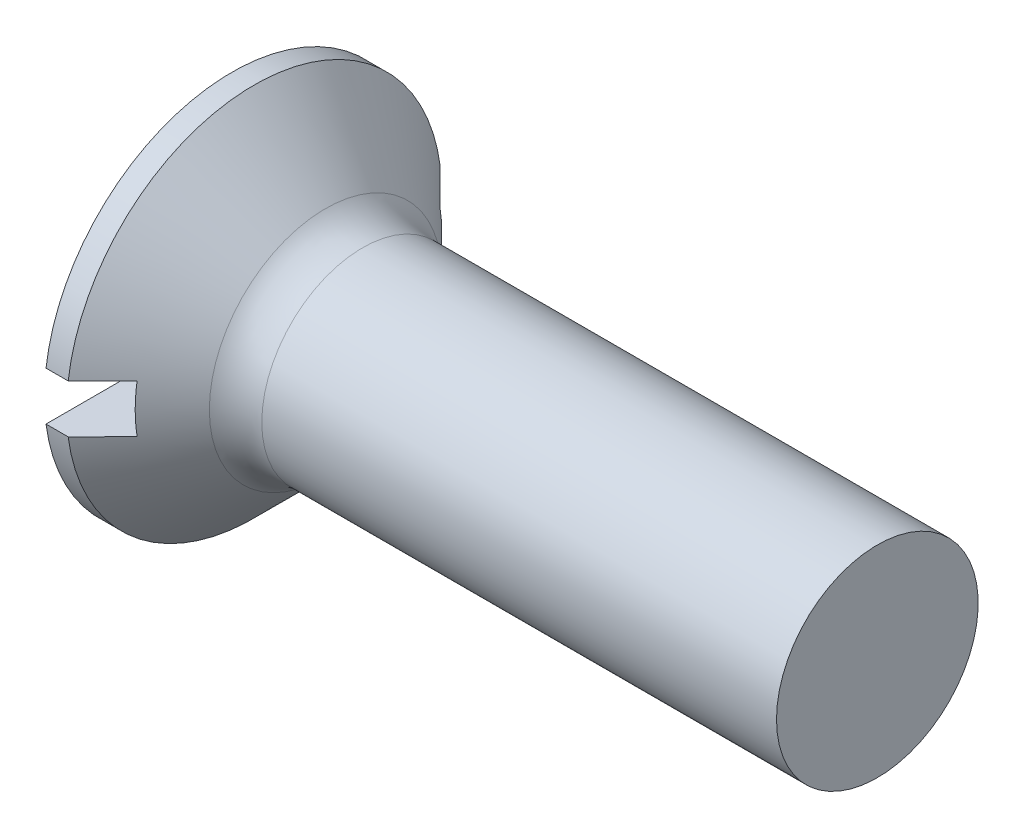
ISO-10303-21;
HEADER;
FILE_DESCRIPTION(('STEP AP214'),'2;1');
FILE_NAME('part.step','',(''),(''),'','','');
FILE_SCHEMA(('AUTOMOTIVE_DESIGN { 1 0 10303 214 1 1 1 1 }'));
ENDSEC;
DATA;
#1=APPLICATION_CONTEXT('core data for automotive mechanical design processes');
#2=APPLICATION_PROTOCOL_DEFINITION('international standard','automotive_design',2000,#1);
#3=PRODUCT_CONTEXT('',#1,'mechanical');
#4=PRODUCT('Part','Part','',(#3));
#5=PRODUCT_RELATED_PRODUCT_CATEGORY('part','',(#4));
#6=PRODUCT_DEFINITION_FORMATION('','',#4);
#7=PRODUCT_DEFINITION_CONTEXT('part definition',#1,'design');
#8=PRODUCT_DEFINITION('design','',#6,#7);
#9=PRODUCT_DEFINITION_SHAPE('','',#8);
#10=(LENGTH_UNIT() NAMED_UNIT(*) SI_UNIT(.MILLI.,.METRE.));
#11=(NAMED_UNIT(*) PLANE_ANGLE_UNIT() SI_UNIT($,.RADIAN.));
#12=(NAMED_UNIT(*) SI_UNIT($,.STERADIAN.) SOLID_ANGLE_UNIT());
#13=UNCERTAINTY_MEASURE_WITH_UNIT(LENGTH_MEASURE(1.E-05),#10,'distance_accuracy_value','');
#14=(GEOMETRIC_REPRESENTATION_CONTEXT(3) GLOBAL_UNCERTAINTY_ASSIGNED_CONTEXT((#13)) GLOBAL_UNIT_ASSIGNED_CONTEXT((#10,
#11,#12)) REPRESENTATION_CONTEXT('',''));
#15=CARTESIAN_POINT('',(0.,0.,0.));
#16=DIRECTION('',(0.,0.,1.));
#17=DIRECTION('',(1.,0.,0.));
#18=AXIS2_PLACEMENT_3D('',#15,#16,#17);
#19=CARTESIAN_POINT('',(-6.34999999999999,0.,0.));
#20=DIRECTION('',(-1.,0.,0.));
#21=DIRECTION('',(0.,0.,1.));
#22=AXIS2_PLACEMENT_3D('',#19,#20,#21);
#23=CYLINDRICAL_SURFACE('',#22,4.65);
#24=DIRECTION('',(-1.,0.,0.));
#25=VECTOR('',#24,1.);
#26=CARTESIAN_POINT('',(-6.34999999999999,0.599999999999999,-4.61112784468182));
#27=LINE('',#26,#25);
#28=CARTESIAN_POINT('',(0.,0.599999999999999,-4.61112784468182));
#29=VERTEX_POINT('',#28);
#30=CARTESIAN_POINT('',(0.550000000000008,0.599999999999999,-4.61112784468182));
#31=VERTEX_POINT('',#30);
#32=EDGE_CURVE('E59',#29,#31,#27,.F.);
#33=ORIENTED_EDGE('',*,*,#32,.F.);
#34=CARTESIAN_POINT('',(0.,0.,0.));
#35=DIRECTION('',(-1.,0.,0.));
#36=DIRECTION('',(0.,0.,1.));
#37=AXIS2_PLACEMENT_3D('',#34,#35,#36);
#38=CIRCLE('',#37,4.65);
#39=CARTESIAN_POINT('',(0.,0.600000000000001,4.61112784468182));
#40=VERTEX_POINT('',#39);
#41=EDGE_CURVE('E106',#40,#29,#38,.T.);
#42=ORIENTED_EDGE('',*,*,#41,.F.);
#43=DIRECTION('',(-1.,0.,0.));
#44=VECTOR('',#43,1.);
#45=CARTESIAN_POINT('',(-6.34999999999999,0.6,4.61112784468182));
#46=LINE('',#45,#44);
#47=CARTESIAN_POINT('',(0.550000000000008,0.6,4.61112784468182));
#48=VERTEX_POINT('',#47);
#49=EDGE_CURVE('E148',#48,#40,#46,.T.);
#50=ORIENTED_EDGE('',*,*,#49,.F.);
#51=CARTESIAN_POINT('',(0.550000000000008,0.,0.));
#52=DIRECTION('',(-1.,0.,0.));
#53=DIRECTION('',(0.,0.,1.));
#54=AXIS2_PLACEMENT_3D('',#51,#52,#53);
#55=CIRCLE('',#54,4.65);
#56=EDGE_CURVE('E115',#48,#31,#55,.T.);
#57=ORIENTED_EDGE('',*,*,#56,.T.);
#58=EDGE_LOOP('',(#33,#42,#50,#57));
#59=FACE_BOUND('',#58,.T.);
#60=ADVANCED_FACE('F36',(#59),#23,.T.);
#61=CARTESIAN_POINT('',(0.,0.,0.));
#62=DIRECTION('',(-1.,0.,0.));
#63=DIRECTION('',(0.,0.,1.));
#64=AXIS2_PLACEMENT_3D('',#61,#62,#63);
#65=PLANE('',#64);
#66=DIRECTION('',(0.,0.,-1.));
#67=VECTOR('',#66,1.);
#68=CARTESIAN_POINT('',(0.,0.6,0.));
#69=LINE('',#68,#67);
#70=EDGE_CURVE('E93',#40,#29,#69,.T.);
#71=ORIENTED_EDGE('',*,*,#70,.F.);
#72=ORIENTED_EDGE('',*,*,#41,.T.);
#73=EDGE_LOOP('',(#71,#72));
#74=FACE_BOUND('',#73,.T.);
#75=ADVANCED_FACE('F166',(#74),#65,.T.);
#76=CARTESIAN_POINT('',(16.,2.5,0.));
#77=DIRECTION('',(1.,0.,0.));
#78=DIRECTION('',(0.,0.,-1.));
#79=AXIS2_PLACEMENT_3D('',#76,#77,#78);
#80=PLANE('',#79);
#81=CARTESIAN_POINT('',(16.,0.,0.));
#82=DIRECTION('',(-1.,0.,0.));
#83=DIRECTION('',(0.,0.,1.));
#84=AXIS2_PLACEMENT_3D('',#81,#82,#83);
#85=CIRCLE('',#84,2.5);
#86=CARTESIAN_POINT('',(16.,0.,2.5));
#87=VERTEX_POINT('',#86);
#88=EDGE_CURVE('E116',#87,#87,#85,.T.);
#89=ORIENTED_EDGE('',*,*,#88,.F.);
#90=EDGE_LOOP('',(#89));
#91=FACE_BOUND('',#90,.T.);
#92=ADVANCED_FACE('F177',(#91),#80,.T.);
#93=CARTESIAN_POINT('',(-6.34999999999999,0.,0.));
#94=DIRECTION('',(-1.,0.,0.));
#95=DIRECTION('',(0.,0.,1.));
#96=AXIS2_PLACEMENT_3D('',#93,#94,#95);
#97=CYLINDRICAL_SURFACE('',#96,2.5);
#98=CARTESIAN_POINT('',(3.23847763108502,0.,0.));
#99=DIRECTION('',(-1.,0.,0.));
#100=DIRECTION('',(0.,0.,1.));
#101=AXIS2_PLACEMENT_3D('',#98,#99,#100);
#102=CIRCLE('',#101,2.5);
#103=CARTESIAN_POINT('',(3.23847763108502,0.,2.5));
#104=VERTEX_POINT('',#103);
#105=EDGE_CURVE('E94',#104,#104,#102,.F.);
#106=ORIENTED_EDGE('',*,*,#105,.T.);
#107=EDGE_LOOP('',(#106));
#108=FACE_BOUND('',#107,.T.);
#109=ORIENTED_EDGE('',*,*,#88,.T.);
#110=EDGE_LOOP('',(#109));
#111=FACE_BOUND('',#110,.T.);
#112=ADVANCED_FACE('F171',(#108,#111),#97,.T.);
#113=CARTESIAN_POINT('',(0.550000000000008,0.,0.));
#114=DIRECTION('',(-1.,0.,0.));
#115=DIRECTION('',(0.,0.,1.));
#116=AXIS2_PLACEMENT_3D('',#113,#114,#115);
#117=CONICAL_SURFACE('',#116,4.65,0.78539816339745);
#118=CARTESIAN_POINT('',(-5.05345798085363,0.599999999999999,-10.2358878738061));
#119=CARTESIAN_POINT('',(-4.7063338820772,0.599999999999999,-9.88816346765386));
#120=CARTESIAN_POINT('',(-4.35923588911081,0.599999999999999,-9.54041298783456));
#121=CARTESIAN_POINT('',(-3.66512028999245,0.599999999999999,-8.84482295341688));
#122=CARTESIAN_POINT('',(-3.31810268492326,0.599999999999999,-8.49698339773806));
#123=CARTESIAN_POINT('',(-2.6240861085145,0.599999999999999,-7.80108810044584));
#124=CARTESIAN_POINT('',(-2.27708717061556,0.599999999999999,-7.45303232547743));
#125=CARTESIAN_POINT('',(-1.58327190960451,0.599999999999999,-6.75674744401149));
#126=CARTESIAN_POINT('',(-1.23645558427177,0.599999999999999,-6.40851833972679));
#127=CARTESIAN_POINT('',(-0.530234288880178,0.599999999999999,-5.69884909860565));
#128=CARTESIAN_POINT('',(-0.170839920396749,0.599999999999999,-5.3373984063476));
#129=CARTESIAN_POINT('',(0.367846499606963,0.599999999999999,-4.79480605507249));
#130=CARTESIAN_POINT('',(0.547344617567886,0.599999999999999,-4.61386901631147));
#131=CARTESIAN_POINT('',(0.906142780462511,0.599999999999999,-4.251800035553));
#132=CARTESIAN_POINT('',(1.08544282617177,0.599999999999999,-4.07066809432422));
#133=CARTESIAN_POINT('',(1.44372217573977,0.599999999999999,-3.70815209675442));
#134=CARTESIAN_POINT('',(1.62270153193744,0.6,-3.52676809217752));
#135=CARTESIAN_POINT('',(1.98021132361776,0.6,-3.16355280067778));
#136=CARTESIAN_POINT('',(2.1587417523097,0.6,-2.98172150707034));
#137=CARTESIAN_POINT('',(2.51504600954838,0.6,-2.61734150295503));
#138=CARTESIAN_POINT('',(2.69281988935326,0.6,-2.43479284271594));
#139=CARTESIAN_POINT('',(2.95840184240507,0.6,-2.15993102072038));
#140=CARTESIAN_POINT('',(3.0467482793297,0.6,-2.06813839931134));
#141=CARTESIAN_POINT('',(3.22290791170148,0.6,-1.8840432741785));
#142=CARTESIAN_POINT('',(3.31072111192471,0.6,-1.79174077503573));
#143=CARTESIAN_POINT('',(3.44507973379147,0.6,-1.64924720242533));
#144=CARTESIAN_POINT('',(3.49191887004633,0.6,-1.59933324859849));
#145=CARTESIAN_POINT('',(3.58528403723339,0.6,-1.49921165532858));
#146=CARTESIAN_POINT('',(3.63181006313953,0.6,-1.44900401119525));
#147=CARTESIAN_POINT('',(3.72427703260543,0.6,-1.348388660684));
#148=CARTESIAN_POINT('',(3.77021949037902,0.6,-1.29798234998228));
#149=CARTESIAN_POINT('',(3.86152904277955,0.6,-1.19665513561933));
#150=CARTESIAN_POINT('',(3.90689615796224,0.6,-1.1457342504602));
#151=CARTESIAN_POINT('',(4.01209252723327,0.6,-1.02578570206612));
#152=CARTESIAN_POINT('',(4.07160553566885,0.6,-0.956477036268247));
#153=CARTESIAN_POINT('',(4.15917887607318,0.6,-0.850702358470613));
#154=CARTESIAN_POINT('',(4.18818199499264,0.6,-0.815019024045418));
#155=CARTESIAN_POINT('',(4.24528795110788,0.6,-0.742941326145325));
#156=CARTESIAN_POINT('',(4.27339088381092,0.6,-0.706547038764567));
#157=CARTESIAN_POINT('',(4.32869682497791,0.6,-0.632291545018036));
#158=CARTESIAN_POINT('',(4.35588213575686,0.6,-0.594417046382877));
#159=CARTESIAN_POINT('',(4.40832254729278,0.6,-0.517260214202537));
#160=CARTESIAN_POINT('',(4.43357498481566,0.6,-0.477976043956169));
#161=CARTESIAN_POINT('',(4.48075024121381,0.6,-0.397940392744045));
#162=CARTESIAN_POINT('',(4.50270366327433,0.6,-0.357207379701578));
#163=CARTESIAN_POINT('',(4.54164745720656,0.6,-0.273493725174854));
#164=CARTESIAN_POINT('',(4.55865364653391,0.6,-0.230520776744234));
#165=CARTESIAN_POINT('',(4.58372379462179,0.6,-0.145820085871144));
#166=CARTESIAN_POINT('',(4.59242377597666,0.6,-0.104295783748555));
#167=CARTESIAN_POINT('',(4.59893532241227,0.6,-0.0414391937715868));
#168=CARTESIAN_POINT('',(4.60002000613735,0.6,-0.0204304556953823));
#169=CARTESIAN_POINT('',(4.59997943950967,0.6,0.0215839024601802));
#170=CARTESIAN_POINT('',(4.59885411345371,0.6,0.0425895224080781));
#171=CARTESIAN_POINT('',(4.59227145283522,0.6,0.105015205121541));
#172=CARTESIAN_POINT('',(4.58363501258282,0.6,0.1461245792122));
#173=CARTESIAN_POINT('',(4.565808560724,0.6,0.206345557501642));
#174=CARTESIAN_POINT('',(4.55901965609655,0.6,0.226250715937574));
#175=CARTESIAN_POINT('',(4.54410905338993,0.6,0.265557322006365));
#176=CARTESIAN_POINT('',(4.53598757591988,0.6,0.284958852400758));
#177=CARTESIAN_POINT('',(4.51162458134292,0.6,0.33886087793319));
#178=CARTESIAN_POINT('',(4.49415337187064,0.6,0.372800556957469));
#179=CARTESIAN_POINT('',(4.45684225886175,0.6,0.439365473741558));
#180=CARTESIAN_POINT('',(4.436999696206,0.6,0.471989179975826));
#181=CARTESIAN_POINT('',(4.39563171221961,0.6,0.536298629600311));
#182=CARTESIAN_POINT('',(4.37410080185607,0.6,0.567980809264082));
#183=CARTESIAN_POINT('',(4.32989042558404,0.6,0.630537340732859));
#184=CARTESIAN_POINT('',(4.30721068113902,0.6,0.661411493852085));
#185=CARTESIAN_POINT('',(4.23751211011742,0.6,0.753681353138899));
#186=CARTESIAN_POINT('',(4.18923822306601,0.6,0.814124888465016));
#187=CARTESIAN_POINT('',(4.0909576629573,0.6,0.933321700638785));
#188=CARTESIAN_POINT('',(4.04095530157681,0.6,0.992078596429102));
#189=CARTESIAN_POINT('',(3.94086297328448,0.6,1.10735067105448));
#190=CARTESIAN_POINT('',(3.89079728066038,0.6,1.16388697288741));
#191=CARTESIAN_POINT('',(3.78992367247538,0.6,1.27629304811311));
#192=CARTESIAN_POINT('',(3.73911573838906,0.6,1.33216280480632));
#193=CARTESIAN_POINT('',(3.58591315191241,0.6,1.49908452635045));
#194=CARTESIAN_POINT('',(3.4827535526898,0.6,1.609433299801));
#195=CARTESIAN_POINT('',(3.27521830235561,0.6,1.82922471356774));
#196=CARTESIAN_POINT('',(3.17084134295835,0.6,1.93866611055463));
#197=CARTESIAN_POINT('',(2.96141984922221,0.6,2.15689179192462));
#198=CARTESIAN_POINT('',(2.85637536705428,0.6,2.26567612639587));
#199=CARTESIAN_POINT('',(2.64692360208388,0.6,2.481710644307));
#200=CARTESIAN_POINT('',(2.54252076901649,0.6,2.58896514889977));
#201=CARTESIAN_POINT('',(2.33341496587688,0.6,2.80318525747578));
#202=CARTESIAN_POINT('',(2.22871198983414,0.6,2.91015085562865));
#203=CARTESIAN_POINT('',(1.91438863951787,0.6,3.23063427951566));
#204=CARTESIAN_POINT('',(1.70445280610492,0.6,3.44384256715819));
#205=CARTESIAN_POINT('',(1.22510768237794,0.600000000000001,3.9295930523411));
#206=CARTESIAN_POINT('',(0.9555489283914,0.600000000000001,4.20198758385551));
#207=CARTESIAN_POINT('',(0.416004890581449,0.600000000000001,4.74635530428132));
#208=CARTESIAN_POINT('',(0.146019605475203,0.600000000000001,5.01832849192059));
#209=CARTESIAN_POINT('',(-0.664426807694018,0.600000000000001,5.83398149060915));
#210=CARTESIAN_POINT('',(-1.2052682118604,0.600000000000001,6.37728333249965));
#211=CARTESIAN_POINT('',(-2.297244515822,0.600000000000001,7.47334328359636));
#212=CARTESIAN_POINT('',(-2.84838746103815,0.600000000000001,8.02609337109332));
#213=CARTESIAN_POINT('',(-3.95082527410524,0.600000000000001,9.1312059158983));
#214=CARTESIAN_POINT('',(-4.5021200841492,0.600000000000001,9.683568430867));
#215=CARTESIAN_POINT('',(-5.05345798085363,0.600000000000001,10.2358878738061));
#216=B_SPLINE_CURVE_WITH_KNOTS('',3,(#118,#119,#120,#121,#122,#123,#124,#125,#126,#127,#128,
#129,#130,#131,#132,#133,#134,#135,#136,#137,#138,#139,#140,#141,#142,#143,#144,#145,#146,#147,
#148,#149,#150,#151,#152,#153,#154,#155,#156,#157,#158,#159,#160,#161,#162,#163,#164,#165,#166,
#167,#168,#169,#170,#171,#172,#173,#174,#175,#176,#177,#178,#179,#180,#181,#182,#183,#184,#185,
#186,#187,#188,#189,#190,#191,#192,#193,#194,#195,#196,#197,#198,#199,#200,#201,#202,#203,#204,
#205,#206,#207,#208,#209,#210,#211,#212,#213,#214,#215),.UNSPECIFIED.,.F.,.F.,(4,2,2,2,2,2,2,2,
2,2,2,2,2,2,2,2,2,2,2,2,2,2,2,2,2,2,2,2,2,2,2,2,2,2,2,2,2,2,2,2,2,2,2,2,2,2,2,2,4),(0.,
1.47399683090689,2.94801247877137,4.42244783615749,5.89686482953468,7.42601395143836,
8.19061836510007,8.95521977425754,9.71968231604465,10.4841563527515,11.2485777423704,
11.630779125471,12.0129770802189,12.2183239645211,12.4236741372326,12.6282760301194,
12.8328705923058,13.1068888942381,13.2448295456087,13.3827555130536,13.522578829549,
13.6625914591711,13.8012122737476,13.9393848876123,14.0658401529418,14.1288404679688,
14.1918429410897,14.3170190368162,14.3800826362346,14.4431358059084,14.557498941854,
14.6719915440135,14.7868731764568,14.9017827966977,15.1337679990585,15.365211229124,
15.5917537379438,15.8183019106741,16.2714608987008,16.7251625423049,17.1788291521206,
17.6278622396792,18.076904322379,18.9745538574966,20.1242253982685,21.2739004034116,
23.5737206872119,25.9154338775763,28.2566456069255),.UNSPECIFIED.);
#217=CARTESIAN_POINT('',(1.4,0.6,3.75233260785875));
#218=VERTEX_POINT('',#217);
#219=EDGE_CURVE('E111',#218,#48,#216,.T.);
#220=ORIENTED_EDGE('',*,*,#219,.F.);
#221=CARTESIAN_POINT('',(1.4,0.,0.));
#222=DIRECTION('',(1.,0.,0.));
#223=DIRECTION('',(0.,0.,-1.));
#224=AXIS2_PLACEMENT_3D('',#221,#222,#223);
#225=CIRCLE('',#224,3.80000000000001);
#226=CARTESIAN_POINT('',(1.4,-0.600000000000001,3.75233260785875));
#227=VERTEX_POINT('',#226);
#228=EDGE_CURVE('E11',#227,#218,#225,.F.);
#229=ORIENTED_EDGE('',*,*,#228,.F.);
#230=CARTESIAN_POINT('',(-5.05345798085363,-0.600000000000001,10.2358878738061));
#231=CARTESIAN_POINT('',(-4.7063338820772,-0.600000000000001,9.88816346765386));
#232=CARTESIAN_POINT('',(-4.35923588911081,-0.600000000000001,9.54041298783456));
#233=CARTESIAN_POINT('',(-3.66512028999245,-0.600000000000001,8.84482295341688));
#234=CARTESIAN_POINT('',(-3.31810268492326,-0.600000000000001,8.49698339773806));
#235=CARTESIAN_POINT('',(-2.6240861085145,-0.600000000000001,7.80108810044584));
#236=CARTESIAN_POINT('',(-2.27708717061556,-0.600000000000001,7.45303232547743));
#237=CARTESIAN_POINT('',(-1.58327190960451,-0.600000000000001,6.75674744401148));
#238=CARTESIAN_POINT('',(-1.23645558427177,-0.600000000000001,6.40851833972678));
#239=CARTESIAN_POINT('',(-0.530234288880175,-0.600000000000001,5.69884909860565));
#240=CARTESIAN_POINT('',(-0.170839920396746,-0.600000000000001,5.3373984063476));
#241=CARTESIAN_POINT('',(0.367846499606966,-0.600000000000001,4.79480605507249));
#242=CARTESIAN_POINT('',(0.547344617567889,-0.600000000000001,4.61386901631146));
#243=CARTESIAN_POINT('',(0.906142780462514,-0.600000000000001,4.251800035553));
#244=CARTESIAN_POINT('',(1.08544282617177,-0.600000000000001,4.07066809432422));
#245=CARTESIAN_POINT('',(1.44372217573977,-0.600000000000001,3.70815209675441));
#246=CARTESIAN_POINT('',(1.62270153193744,-0.600000000000001,3.52676809217752));
#247=CARTESIAN_POINT('',(1.98021132361776,-0.600000000000001,3.16355280067778));
#248=CARTESIAN_POINT('',(2.1587417523097,-0.600000000000001,2.98172150707033));
#249=CARTESIAN_POINT('',(2.51504600954839,-0.600000000000001,2.61734150295503));
#250=CARTESIAN_POINT('',(2.69281988935326,-0.600000000000001,2.43479284271593));
#251=CARTESIAN_POINT('',(2.95840184240507,-0.600000000000001,2.15993102072037));
#252=CARTESIAN_POINT('',(3.0467482793297,-0.600000000000001,2.06813839931134));
#253=CARTESIAN_POINT('',(3.22290791170148,-0.600000000000001,1.88404327417849));
#254=CARTESIAN_POINT('',(3.31072111192471,-0.600000000000001,1.79174077503573));
#255=CARTESIAN_POINT('',(3.44507973379147,-0.600000000000001,1.64924720242533));
#256=CARTESIAN_POINT('',(3.49191887004633,-0.600000000000001,1.59933324859849));
#257=CARTESIAN_POINT('',(3.58528403723339,-0.600000000000001,1.49921165532858));
#258=CARTESIAN_POINT('',(3.63181006313953,-0.600000000000001,1.44900401119525));
#259=CARTESIAN_POINT('',(3.72427703260543,-0.600000000000001,1.348388660684));
#260=CARTESIAN_POINT('',(3.77021949037902,-0.600000000000001,1.29798234998228));
#261=CARTESIAN_POINT('',(3.86152904277955,-0.600000000000001,1.19665513561933));
#262=CARTESIAN_POINT('',(3.90689615796224,-0.600000000000001,1.1457342504602));
#263=CARTESIAN_POINT('',(4.01209252723327,-0.600000000000001,1.02578570206612));
#264=CARTESIAN_POINT('',(4.07160553566885,-0.600000000000001,0.956477036268246));
#265=CARTESIAN_POINT('',(4.15917887607317,-0.600000000000001,0.850702358470612));
#266=CARTESIAN_POINT('',(4.18818199499264,-0.600000000000001,0.815019024045418));
#267=CARTESIAN_POINT('',(4.24528795110788,-0.600000000000001,0.742941326145326));
#268=CARTESIAN_POINT('',(4.27339088381092,-0.600000000000001,0.706547038764567));
#269=CARTESIAN_POINT('',(4.32869682497791,-0.600000000000001,0.632291545018035));
#270=CARTESIAN_POINT('',(4.35588213575686,-0.600000000000001,0.594417046382876));
#271=CARTESIAN_POINT('',(4.40832254729278,-0.600000000000001,0.517260214202537));
#272=CARTESIAN_POINT('',(4.43357498481566,-0.600000000000001,0.477976043956169));
#273=CARTESIAN_POINT('',(4.48075024121381,-0.600000000000001,0.397940392744045));
#274=CARTESIAN_POINT('',(4.50270366327432,-0.600000000000001,0.357207379701577));
#275=CARTESIAN_POINT('',(4.54164745720656,-0.600000000000001,0.273493725174853));
#276=CARTESIAN_POINT('',(4.55865364653391,-0.600000000000001,0.230520776744233));
#277=CARTESIAN_POINT('',(4.58372379462179,-0.600000000000001,0.145820085871143));
#278=CARTESIAN_POINT('',(4.59242377597666,-0.600000000000001,0.104295783748554));
#279=CARTESIAN_POINT('',(4.59893532241227,-0.600000000000001,0.0414391937715858));
#280=CARTESIAN_POINT('',(4.60002000613735,-0.600000000000001,0.0204304556953813));
#281=CARTESIAN_POINT('',(4.59997943950967,-0.600000000000001,-0.0215839024601812));
#282=CARTESIAN_POINT('',(4.59885411345371,-0.600000000000001,-0.0425895224080791));
#283=CARTESIAN_POINT('',(4.59227145283522,-0.600000000000001,-0.105015205121542));
#284=CARTESIAN_POINT('',(4.58363501258282,-0.600000000000001,-0.146124579212201));
#285=CARTESIAN_POINT('',(4.565808560724,-0.600000000000001,-0.206345557501643));
#286=CARTESIAN_POINT('',(4.55901965609655,-0.600000000000001,-0.226250715937575));
#287=CARTESIAN_POINT('',(4.54410905338993,-0.600000000000001,-0.265557322006366));
#288=CARTESIAN_POINT('',(4.53598757591988,-0.600000000000001,-0.284958852400759));
#289=CARTESIAN_POINT('',(4.51162458134292,-0.600000000000001,-0.338860877933191));
#290=CARTESIAN_POINT('',(4.49415337187064,-0.600000000000001,-0.37280055695747));
#291=CARTESIAN_POINT('',(4.45684225886175,-0.600000000000001,-0.439365473741559));
#292=CARTESIAN_POINT('',(4.43699969620599,-0.600000000000001,-0.471989179975827));
#293=CARTESIAN_POINT('',(4.3956317122196,-0.600000000000001,-0.536298629600312));
#294=CARTESIAN_POINT('',(4.37410080185606,-0.600000000000001,-0.567980809264083));
#295=CARTESIAN_POINT('',(4.32989042558404,-0.600000000000001,-0.630537340732861));
#296=CARTESIAN_POINT('',(4.30721068113901,-0.600000000000001,-0.661411493852087));
#297=CARTESIAN_POINT('',(4.23751211011741,-0.600000000000001,-0.753681353138901));
#298=CARTESIAN_POINT('',(4.18923822306601,-0.600000000000001,-0.814124888465018));
#299=CARTESIAN_POINT('',(4.09095766295729,-0.600000000000001,-0.933321700638788));
#300=CARTESIAN_POINT('',(4.04095530157681,-0.600000000000001,-0.992078596429105));
#301=CARTESIAN_POINT('',(3.94086297328448,-0.600000000000001,-1.10735067105448));
#302=CARTESIAN_POINT('',(3.89079728066038,-0.600000000000001,-1.16388697288741));
#303=CARTESIAN_POINT('',(3.78992367247537,-0.600000000000001,-1.27629304811312));
#304=CARTESIAN_POINT('',(3.73911573838905,-0.600000000000001,-1.33216280480632));
#305=CARTESIAN_POINT('',(3.58591315191241,-0.600000000000001,-1.49908452635045));
#306=CARTESIAN_POINT('',(3.48275355268979,-0.600000000000001,-1.609433299801));
#307=CARTESIAN_POINT('',(3.2752183023556,-0.600000000000001,-1.82922471356774));
#308=CARTESIAN_POINT('',(3.17084134295834,-0.600000000000001,-1.93866611055464));
#309=CARTESIAN_POINT('',(2.96141984922221,-0.600000000000001,-2.15689179192463));
#310=CARTESIAN_POINT('',(2.85637536705427,-0.600000000000001,-2.26567612639588));
#311=CARTESIAN_POINT('',(2.64692360208388,-0.600000000000001,-2.48171064430701));
#312=CARTESIAN_POINT('',(2.54252076901649,-0.600000000000001,-2.58896514889978));
#313=CARTESIAN_POINT('',(2.33341496587688,-0.600000000000001,-2.80318525747578));
#314=CARTESIAN_POINT('',(2.22871198983413,-0.600000000000001,-2.91015085562865));
#315=CARTESIAN_POINT('',(1.91438863951786,-0.600000000000001,-3.23063427951567));
#316=CARTESIAN_POINT('',(1.70445280610491,-0.600000000000001,-3.4438425671582));
#317=CARTESIAN_POINT('',(1.22510768237793,-0.600000000000001,-3.92959305234111));
#318=CARTESIAN_POINT('',(0.955548928391392,-0.600000000000001,-4.20198758385552));
#319=CARTESIAN_POINT('',(0.416004890581442,-0.600000000000001,-4.74635530428133));
#320=CARTESIAN_POINT('',(0.146019605475196,-0.600000000000001,-5.0183284919206));
#321=CARTESIAN_POINT('',(-0.664426807694024,-0.600000000000001,-5.83398149060915));
#322=CARTESIAN_POINT('',(-1.2052682118604,-0.600000000000001,-6.37728333249966));
#323=CARTESIAN_POINT('',(-2.29724451582201,-0.600000000000001,-7.47334328359636));
#324=CARTESIAN_POINT('',(-2.84838746103816,-0.600000000000001,-8.02609337109332));
#325=CARTESIAN_POINT('',(-3.95082527410525,-0.600000000000001,-9.1312059158983));
#326=CARTESIAN_POINT('',(-4.5021200841492,-0.600000000000001,-9.68356843086701));
#327=CARTESIAN_POINT('',(-5.05345798085363,-0.600000000000001,-10.2358878738061));
#328=B_SPLINE_CURVE_WITH_KNOTS('',3,(#230,#231,#232,#233,#234,#235,#236,#237,#238,#239,#240,
#241,#242,#243,#244,#245,#246,#247,#248,#249,#250,#251,#252,#253,#254,#255,#256,#257,#258,#259,
#260,#261,#262,#263,#264,#265,#266,#267,#268,#269,#270,#271,#272,#273,#274,#275,#276,#277,#278,
#279,#280,#281,#282,#283,#284,#285,#286,#287,#288,#289,#290,#291,#292,#293,#294,#295,#296,#297,
#298,#299,#300,#301,#302,#303,#304,#305,#306,#307,#308,#309,#310,#311,#312,#313,#314,#315,#316,
#317,#318,#319,#320,#321,#322,#323,#324,#325,#326,#327),.UNSPECIFIED.,.F.,.F.,(4,2,2,2,2,2,2,2,
2,2,2,2,2,2,2,2,2,2,2,2,2,2,2,2,2,2,2,2,2,2,2,2,2,2,2,2,2,2,2,2,2,2,2,2,2,2,2,2,4),(0.,
1.47399683090689,2.94801247877137,4.4224478361575,5.89686482953469,7.42601395143836,
8.19061836510007,8.95521977425755,9.71968231604465,10.4841563527515,11.2485777423704,
11.630779125471,12.0129770802189,12.2183239645211,12.4236741372326,12.6282760301194,
12.8328705923058,13.1068888942381,13.2448295456087,13.3827555130536,13.522578829549,
13.6625914591711,13.8012122737476,13.9393848876123,14.0658401529418,14.1288404679688,
14.1918429410897,14.3170190368162,14.3800826362346,14.4431358059084,14.557498941854,
14.6719915440135,14.7868731764568,14.9017827966977,15.1337679990585,15.365211229124,
15.5917537379438,15.8183019106741,16.2714608987008,16.7251625423049,17.1788291521206,
17.6278622396792,18.076904322379,18.9745538574966,20.1242253982686,21.2739004034116,
23.5737206872119,25.9154338775763,28.2566456069255),.UNSPECIFIED.);
#329=CARTESIAN_POINT('',(0.550000000000008,-0.600000000000001,4.61112784468182));
#330=VERTEX_POINT('',#329);
#331=EDGE_CURVE('E102',#330,#227,#328,.T.);
#332=ORIENTED_EDGE('',*,*,#331,.F.);
#333=CARTESIAN_POINT('',(0.550000000000008,-0.600000000000001,-4.61112784468182));
#334=VERTEX_POINT('',#333);
#335=EDGE_CURVE('E101',#334,#330,#55,.T.);
#336=ORIENTED_EDGE('',*,*,#335,.F.);
#337=CARTESIAN_POINT('',(1.4,-0.600000000000001,-3.75233260785875));
#338=VERTEX_POINT('',#337);
#339=EDGE_CURVE('E103',#338,#334,#328,.T.);
#340=ORIENTED_EDGE('',*,*,#339,.F.);
#341=CARTESIAN_POINT('',(1.4,0.599999999999999,-3.75233260785875));
#342=VERTEX_POINT('',#341);
#343=EDGE_CURVE('E40',#342,#338,#225,.F.);
#344=ORIENTED_EDGE('',*,*,#343,.F.);
#345=EDGE_CURVE('E107',#31,#342,#216,.T.);
#346=ORIENTED_EDGE('',*,*,#345,.F.);
#347=ORIENTED_EDGE('',*,*,#56,.F.);
#348=EDGE_LOOP('',(#220,#229,#332,#336,#340,#344,#346,#347));
#349=FACE_BOUND('',#348,.T.);
#350=CARTESIAN_POINT('',(2.31923881554251,0.,0.));
#351=DIRECTION('',(-1.,0.,0.));
#352=DIRECTION('',(0.,0.,1.));
#353=AXIS2_PLACEMENT_3D('',#350,#351,#352);
#354=CIRCLE('',#353,2.88076118445749);
#355=CARTESIAN_POINT('',(2.31923881554251,0.,2.88076118445749));
#356=VERTEX_POINT('',#355);
#357=EDGE_CURVE('E119',#356,#356,#354,.T.);
#358=ORIENTED_EDGE('',*,*,#357,.T.);
#359=EDGE_LOOP('',(#358));
#360=FACE_BOUND('',#359,.T.);
#361=ADVANCED_FACE('F138',(#349,#360),#117,.T.);
#362=DIRECTION('',(-1.,0.,0.));
#363=VECTOR('',#362,1.);
#364=CARTESIAN_POINT('',(-6.34999999999999,-0.600000000000001,4.61112784468182));
#365=LINE('',#364,#363);
#366=CARTESIAN_POINT('',(0.,-0.600000000000001,4.61112784468182));
#367=VERTEX_POINT('',#366);
#368=EDGE_CURVE('E88',#367,#330,#365,.F.);
#369=ORIENTED_EDGE('',*,*,#368,.F.);
#370=CARTESIAN_POINT('',(0.,-0.600000000000001,-4.61112784468182));
#371=VERTEX_POINT('',#370);
#372=EDGE_CURVE('E99',#371,#367,#38,.T.);
#373=ORIENTED_EDGE('',*,*,#372,.F.);
#374=DIRECTION('',(-1.,0.,0.));
#375=VECTOR('',#374,1.);
#376=CARTESIAN_POINT('',(-6.34999999999999,-0.600000000000001,-4.61112784468182));
#377=LINE('',#376,#375);
#378=EDGE_CURVE('E51',#334,#371,#377,.T.);
#379=ORIENTED_EDGE('',*,*,#378,.F.);
#380=ORIENTED_EDGE('',*,*,#335,.T.);
#381=EDGE_LOOP('',(#369,#373,#379,#380));
#382=FACE_BOUND('',#381,.T.);
#383=ADVANCED_FACE('F98',(#382),#23,.T.);
#384=DIRECTION('',(0.,0.,1.));
#385=VECTOR('',#384,1.);
#386=CARTESIAN_POINT('',(0.,-0.600000000000001,0.));
#387=LINE('',#386,#385);
#388=EDGE_CURVE('E85',#371,#367,#387,.T.);
#389=ORIENTED_EDGE('',*,*,#388,.F.);
#390=ORIENTED_EDGE('',*,*,#372,.T.);
#391=EDGE_LOOP('',(#389,#390));
#392=FACE_BOUND('',#391,.T.);
#393=ADVANCED_FACE('F105',(#392),#65,.T.);
#394=CARTESIAN_POINT('',(3.23847763108503,0.,0.));
#395=DIRECTION('',(-1.,0.,0.));
#396=DIRECTION('',(0.,0.,1.));
#397=AXIS2_PLACEMENT_3D('',#394,#395,#396);
#398=TOROIDAL_SURFACE('',#397,3.8,1.3);
#399=ORIENTED_EDGE('',*,*,#105,.F.);
#400=EDGE_LOOP('',(#399));
#401=FACE_BOUND('',#400,.T.);
#402=ORIENTED_EDGE('',*,*,#357,.F.);
#403=EDGE_LOOP('',(#402));
#404=FACE_BOUND('',#403,.T.);
#405=ADVANCED_FACE('F38',(#401,#404),#398,.F.);
#406=CARTESIAN_POINT('',(1.4,0.600000000000001,4.65));
#407=DIRECTION('',(0.,1.,0.));
#408=DIRECTION('',(0.,0.,1.));
#409=AXIS2_PLACEMENT_3D('',#406,#407,#408);
#410=PLANE('',#409);
#411=ORIENTED_EDGE('',*,*,#345,.T.);
#412=DIRECTION('',(0.,0.,-1.));
#413=VECTOR('',#412,1.);
#414=CARTESIAN_POINT('',(1.4,0.600000000000001,4.65));
#415=LINE('',#414,#413);
#416=EDGE_CURVE('E133',#218,#342,#415,.T.);
#417=ORIENTED_EDGE('',*,*,#416,.F.);
#418=ORIENTED_EDGE('',*,*,#219,.T.);
#419=ORIENTED_EDGE('',*,*,#49,.T.);
#420=ORIENTED_EDGE('',*,*,#70,.T.);
#421=ORIENTED_EDGE('',*,*,#32,.T.);
#422=EDGE_LOOP('',(#411,#417,#418,#419,#420,#421));
#423=FACE_BOUND('',#422,.T.);
#424=ADVANCED_FACE('F159',(#423),#410,.F.);
#425=CARTESIAN_POINT('',(1.4,-0.600000000000001,-4.65));
#426=DIRECTION('',(0.,-1.,0.));
#427=DIRECTION('',(0.,0.,-1.));
#428=AXIS2_PLACEMENT_3D('',#425,#426,#427);
#429=PLANE('',#428);
#430=ORIENTED_EDGE('',*,*,#331,.T.);
#431=DIRECTION('',(0.,0.,1.));
#432=VECTOR('',#431,1.);
#433=CARTESIAN_POINT('',(1.4,-0.600000000000001,-4.65));
#434=LINE('',#433,#432);
#435=EDGE_CURVE('E130',#338,#227,#434,.T.);
#436=ORIENTED_EDGE('',*,*,#435,.F.);
#437=ORIENTED_EDGE('',*,*,#339,.T.);
#438=ORIENTED_EDGE('',*,*,#378,.T.);
#439=ORIENTED_EDGE('',*,*,#388,.T.);
#440=ORIENTED_EDGE('',*,*,#368,.T.);
#441=EDGE_LOOP('',(#430,#436,#437,#438,#439,#440));
#442=FACE_BOUND('',#441,.T.);
#443=ADVANCED_FACE('F87',(#442),#429,.F.);
#444=CARTESIAN_POINT('',(1.4,-0.600000000000001,-4.65));
#445=DIRECTION('',(1.,0.,0.));
#446=DIRECTION('',(0.,0.,-1.));
#447=AXIS2_PLACEMENT_3D('',#444,#445,#446);
#448=PLANE('',#447);
#449=ORIENTED_EDGE('',*,*,#228,.T.);
#450=ORIENTED_EDGE('',*,*,#416,.T.);
#451=ORIENTED_EDGE('',*,*,#343,.T.);
#452=ORIENTED_EDGE('',*,*,#435,.T.);
#453=EDGE_LOOP('',(#449,#450,#451,#452));
#454=FACE_BOUND('',#453,.T.);
#455=ADVANCED_FACE('F129',(#454),#448,.F.);
#456=CLOSED_SHELL('',(#60,#75,#92,#112,#361,#383,#393,#405,#424,#443,#455));
#457=MANIFOLD_SOLID_BREP('B2',#456);
#458=ADVANCED_BREP_SHAPE_REPRESENTATION('',(#18,#457),#14);
#459=SHAPE_DEFINITION_REPRESENTATION(#9,#458);
ENDSEC;
END-ISO-10303-21;
